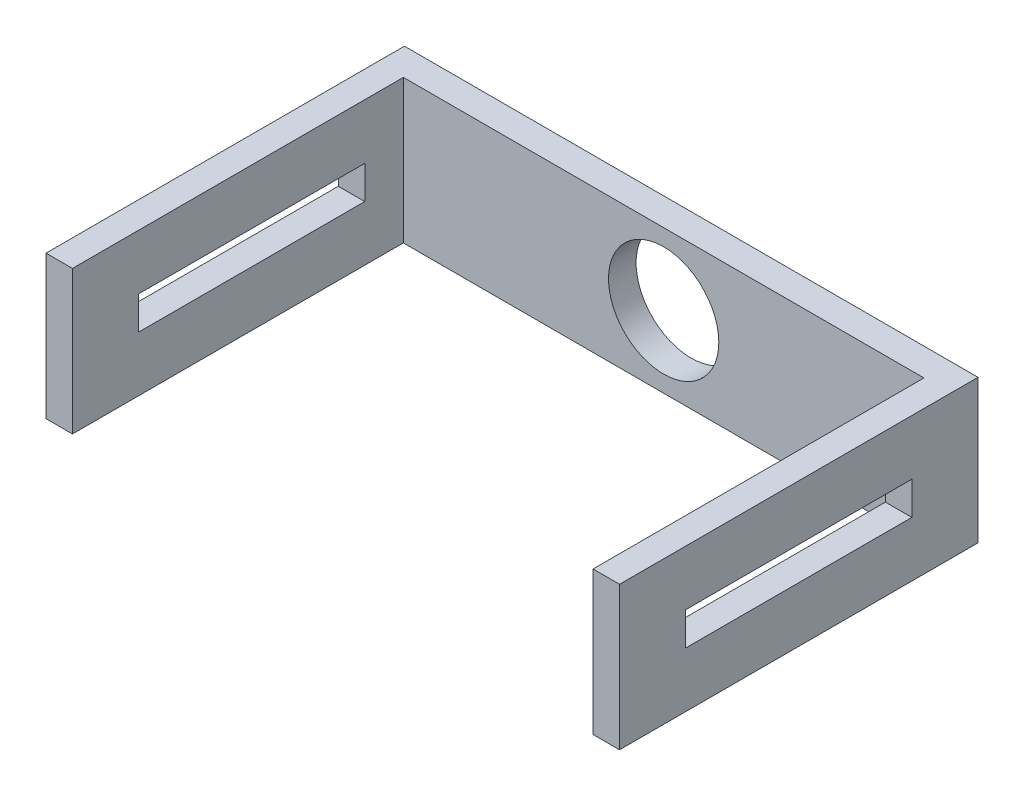
ISO-10303-21;
HEADER;
FILE_DESCRIPTION(('STEP AP214'),'2;1');
FILE_NAME('part.step','',(''),(''),'','','');
FILE_SCHEMA(('AUTOMOTIVE_DESIGN { 1 0 10303 214 1 1 1 1 }'));
ENDSEC;
DATA;
#1=APPLICATION_CONTEXT('core data for automotive mechanical design processes');
#2=APPLICATION_PROTOCOL_DEFINITION('international standard','automotive_design',2000,#1);
#3=PRODUCT_CONTEXT('',#1,'mechanical');
#4=PRODUCT('Part','Part','',(#3));
#5=PRODUCT_RELATED_PRODUCT_CATEGORY('part','',(#4));
#6=PRODUCT_DEFINITION_FORMATION('','',#4);
#7=PRODUCT_DEFINITION_CONTEXT('part definition',#1,'design');
#8=PRODUCT_DEFINITION('design','',#6,#7);
#9=PRODUCT_DEFINITION_SHAPE('','',#8);
#10=(LENGTH_UNIT() NAMED_UNIT(*) SI_UNIT(.MILLI.,.METRE.));
#11=(NAMED_UNIT(*) PLANE_ANGLE_UNIT() SI_UNIT($,.RADIAN.));
#12=(NAMED_UNIT(*) SI_UNIT($,.STERADIAN.) SOLID_ANGLE_UNIT());
#13=UNCERTAINTY_MEASURE_WITH_UNIT(LENGTH_MEASURE(1.E-05),#10,'distance_accuracy_value','');
#14=(GEOMETRIC_REPRESENTATION_CONTEXT(3) GLOBAL_UNCERTAINTY_ASSIGNED_CONTEXT((#13)) GLOBAL_UNIT_ASSIGNED_CONTEXT((#10,
#11,#12)) REPRESENTATION_CONTEXT('',''));
#15=CARTESIAN_POINT('',(0.,0.,0.));
#16=DIRECTION('',(0.,0.,1.));
#17=DIRECTION('',(1.,0.,0.));
#18=AXIS2_PLACEMENT_3D('',#15,#16,#17);
#19=CARTESIAN_POINT('',(0.,0.,2.5));
#20=DIRECTION('',(0.,0.,1.));
#21=DIRECTION('',(1.,0.,0.));
#22=AXIS2_PLACEMENT_3D('',#19,#20,#21);
#23=PLANE('',#22);
#24=CARTESIAN_POINT('',(26.,-6.5,2.5));
#25=DIRECTION('',(0.,0.,1.));
#26=DIRECTION('',(1.,0.,0.));
#27=AXIS2_PLACEMENT_3D('',#24,#25,#26);
#28=CIRCLE('',#27,5.);
#29=CARTESIAN_POINT('',(31.,-6.5,2.5));
#30=VERTEX_POINT('',#29);
#31=EDGE_CURVE('E549',#30,#30,#28,.T.);
#32=ORIENTED_EDGE('',*,*,#31,.F.);
#33=EDGE_LOOP('',(#32));
#34=FACE_BOUND('',#33,.T.);
#35=DIRECTION('',(1.,0.,0.));
#36=VECTOR('',#35,1.);
#37=CARTESIAN_POINT('',(0.,-13.,2.5));
#38=LINE('',#37,#36);
#39=CARTESIAN_POINT('',(2.4,-13.,2.5));
#40=VERTEX_POINT('',#39);
#41=CARTESIAN_POINT('',(49.6,-13.,2.5));
#42=VERTEX_POINT('',#41);
#43=EDGE_CURVE('E277',#40,#42,#38,.T.);
#44=ORIENTED_EDGE('',*,*,#43,.T.);
#45=DIRECTION('',(0.,-1.,0.));
#46=VECTOR('',#45,1.);
#47=CARTESIAN_POINT('',(49.6,0.,2.5));
#48=LINE('',#47,#46);
#49=CARTESIAN_POINT('',(49.6,0.,2.5));
#50=VERTEX_POINT('',#49);
#51=EDGE_CURVE('E224',#50,#42,#48,.T.);
#52=ORIENTED_EDGE('',*,*,#51,.F.);
#53=DIRECTION('',(-1.,0.,0.));
#54=VECTOR('',#53,1.);
#55=CARTESIAN_POINT('',(0.,0.,2.5));
#56=LINE('',#55,#54);
#57=CARTESIAN_POINT('',(2.4,0.,2.5));
#58=VERTEX_POINT('',#57);
#59=EDGE_CURVE('E280',#50,#58,#56,.T.);
#60=ORIENTED_EDGE('',*,*,#59,.T.);
#61=DIRECTION('',(0.,1.,0.));
#62=VECTOR('',#61,1.);
#63=CARTESIAN_POINT('',(2.4,0.,2.5));
#64=LINE('',#63,#62);
#65=EDGE_CURVE('E250',#40,#58,#64,.T.);
#66=ORIENTED_EDGE('',*,*,#65,.F.);
#67=EDGE_LOOP('',(#44,#52,#60,#66));
#68=FACE_BOUND('',#67,.T.);
#69=ADVANCED_FACE('F39',(#34,#68),#23,.T.);
#70=CARTESIAN_POINT('',(0.,0.,2.5));
#71=DIRECTION('',(1.,0.,0.));
#72=DIRECTION('',(0.,1.,0.));
#73=AXIS2_PLACEMENT_3D('',#70,#71,#72);
#74=PLANE('',#73);
#75=DIRECTION('',(0.,0.,1.));
#76=VECTOR('',#75,1.);
#77=CARTESIAN_POINT('',(0.,-8.,6.));
#78=LINE('',#77,#76);
#79=CARTESIAN_POINT('',(0.,-8.,6.));
#80=VERTEX_POINT('',#79);
#81=CARTESIAN_POINT('',(0.,-8.,26.5));
#82=VERTEX_POINT('',#81);
#83=EDGE_CURVE('E170',#80,#82,#78,.T.);
#84=ORIENTED_EDGE('',*,*,#83,.F.);
#85=DIRECTION('',(0.,-1.,0.));
#86=VECTOR('',#85,1.);
#87=CARTESIAN_POINT('',(0.,-5.,6.));
#88=LINE('',#87,#86);
#89=CARTESIAN_POINT('',(0.,-5.,6.));
#90=VERTEX_POINT('',#89);
#91=EDGE_CURVE('E56',#90,#80,#88,.T.);
#92=ORIENTED_EDGE('',*,*,#91,.F.);
#93=DIRECTION('',(0.,0.,-1.));
#94=VECTOR('',#93,1.);
#95=CARTESIAN_POINT('',(0.,-5.,6.));
#96=LINE('',#95,#94);
#97=CARTESIAN_POINT('',(0.,-5.,26.5));
#98=VERTEX_POINT('',#97);
#99=EDGE_CURVE('E178',#98,#90,#96,.T.);
#100=ORIENTED_EDGE('',*,*,#99,.F.);
#101=DIRECTION('',(0.,1.,0.));
#102=VECTOR('',#101,1.);
#103=CARTESIAN_POINT('',(0.,-5.,26.5));
#104=LINE('',#103,#102);
#105=EDGE_CURVE('E160',#82,#98,#104,.T.);
#106=ORIENTED_EDGE('',*,*,#105,.F.);
#107=EDGE_LOOP('',(#84,#92,#100,#106));
#108=FACE_BOUND('',#107,.T.);
#109=DIRECTION('',(0.,-1.,0.));
#110=VECTOR('',#109,1.);
#111=CARTESIAN_POINT('',(0.,0.,0.));
#112=LINE('',#111,#110);
#113=CARTESIAN_POINT('',(0.,0.,0.));
#114=VERTEX_POINT('',#113);
#115=CARTESIAN_POINT('',(0.,-13.,0.));
#116=VERTEX_POINT('',#115);
#117=EDGE_CURVE('E276',#114,#116,#112,.T.);
#118=ORIENTED_EDGE('',*,*,#117,.T.);
#119=DIRECTION('',(0.,0.,-1.));
#120=VECTOR('',#119,1.);
#121=CARTESIAN_POINT('',(0.,-13.,2.5));
#122=LINE('',#121,#120);
#123=CARTESIAN_POINT('',(0.,-13.,32.5));
#124=VERTEX_POINT('',#123);
#125=EDGE_CURVE('E307',#124,#116,#122,.T.);
#126=ORIENTED_EDGE('',*,*,#125,.F.);
#127=DIRECTION('',(0.,-1.,0.));
#128=VECTOR('',#127,1.);
#129=CARTESIAN_POINT('',(0.,0.,32.5));
#130=LINE('',#129,#128);
#131=CARTESIAN_POINT('',(0.,0.,32.5));
#132=VERTEX_POINT('',#131);
#133=EDGE_CURVE('E251',#132,#124,#130,.T.);
#134=ORIENTED_EDGE('',*,*,#133,.F.);
#135=DIRECTION('',(0.,0.,-1.));
#136=VECTOR('',#135,1.);
#137=CARTESIAN_POINT('',(0.,0.,2.5));
#138=LINE('',#137,#136);
#139=EDGE_CURVE('E284',#132,#114,#138,.T.);
#140=ORIENTED_EDGE('',*,*,#139,.T.);
#141=EDGE_LOOP('',(#118,#126,#134,#140));
#142=FACE_BOUND('',#141,.T.);
#143=ADVANCED_FACE('F41',(#108,#142),#74,.F.);
#144=CARTESIAN_POINT('',(0.,-13.,2.5));
#145=DIRECTION('',(0.,1.,0.));
#146=DIRECTION('',(0.,0.,1.));
#147=AXIS2_PLACEMENT_3D('',#144,#145,#146);
#148=PLANE('',#147);
#149=DIRECTION('',(1.,0.,0.));
#150=VECTOR('',#149,1.);
#151=CARTESIAN_POINT('',(0.,-13.,0.));
#152=LINE('',#151,#150);
#153=CARTESIAN_POINT('',(52.,-13.,0.));
#154=VERTEX_POINT('',#153);
#155=EDGE_CURVE('E288',#116,#154,#152,.T.);
#156=ORIENTED_EDGE('',*,*,#155,.T.);
#157=DIRECTION('',(0.,0.,-1.));
#158=VECTOR('',#157,1.);
#159=CARTESIAN_POINT('',(52.,-13.,2.5));
#160=LINE('',#159,#158);
#161=CARTESIAN_POINT('',(52.,-13.,32.5));
#162=VERTEX_POINT('',#161);
#163=EDGE_CURVE('E303',#162,#154,#160,.T.);
#164=ORIENTED_EDGE('',*,*,#163,.F.);
#165=DIRECTION('',(1.,0.,0.));
#166=VECTOR('',#165,1.);
#167=CARTESIAN_POINT('',(52.,-13.,32.5));
#168=LINE('',#167,#166);
#169=CARTESIAN_POINT('',(49.6,-13.,32.5));
#170=VERTEX_POINT('',#169);
#171=EDGE_CURVE('E235',#170,#162,#168,.T.);
#172=ORIENTED_EDGE('',*,*,#171,.F.);
#173=DIRECTION('',(0.,0.,-1.));
#174=VECTOR('',#173,1.);
#175=CARTESIAN_POINT('',(49.6,-13.,32.5));
#176=LINE('',#175,#174);
#177=EDGE_CURVE('E239',#170,#42,#176,.T.);
#178=ORIENTED_EDGE('',*,*,#177,.T.);
#179=ORIENTED_EDGE('',*,*,#43,.F.);
#180=DIRECTION('',(0.,0.,-1.));
#181=VECTOR('',#180,1.);
#182=CARTESIAN_POINT('',(2.4,-13.,32.5));
#183=LINE('',#182,#181);
#184=CARTESIAN_POINT('',(2.4,-13.,32.5));
#185=VERTEX_POINT('',#184);
#186=EDGE_CURVE('E272',#185,#40,#183,.T.);
#187=ORIENTED_EDGE('',*,*,#186,.F.);
#188=DIRECTION('',(1.,0.,0.));
#189=VECTOR('',#188,1.);
#190=CARTESIAN_POINT('',(0.,-13.,32.5));
#191=LINE('',#190,#189);
#192=EDGE_CURVE('E255',#124,#185,#191,.T.);
#193=ORIENTED_EDGE('',*,*,#192,.F.);
#194=ORIENTED_EDGE('',*,*,#125,.T.);
#195=EDGE_LOOP('',(#156,#164,#172,#178,#179,#187,#193,#194));
#196=FACE_BOUND('',#195,.T.);
#197=ADVANCED_FACE('F361',(#196),#148,.F.);
#198=CARTESIAN_POINT('',(52.,0.,2.5));
#199=DIRECTION('',(-1.,0.,0.));
#200=DIRECTION('',(0.,0.,1.));
#201=AXIS2_PLACEMENT_3D('',#198,#199,#200);
#202=PLANE('',#201);
#203=DIRECTION('',(0.,0.,-1.));
#204=VECTOR('',#203,1.);
#205=CARTESIAN_POINT('',(52.,-4.99999999999999,2.5));
#206=LINE('',#205,#204);
#207=CARTESIAN_POINT('',(52.,-4.99999999999999,26.5));
#208=VERTEX_POINT('',#207);
#209=CARTESIAN_POINT('',(52.,-4.99999999999999,6.));
#210=VERTEX_POINT('',#209);
#211=EDGE_CURVE('E212',#208,#210,#206,.T.);
#212=ORIENTED_EDGE('',*,*,#211,.T.);
#213=DIRECTION('',(0.,-1.,0.));
#214=VECTOR('',#213,1.);
#215=CARTESIAN_POINT('',(52.,0.,6.));
#216=LINE('',#215,#214);
#217=CARTESIAN_POINT('',(52.,-7.99999999999999,6.));
#218=VERTEX_POINT('',#217);
#219=EDGE_CURVE('E220',#210,#218,#216,.T.);
#220=ORIENTED_EDGE('',*,*,#219,.T.);
#221=DIRECTION('',(0.,0.,1.));
#222=VECTOR('',#221,1.);
#223=CARTESIAN_POINT('',(52.,-7.99999999999999,2.5));
#224=LINE('',#223,#222);
#225=CARTESIAN_POINT('',(52.,-7.99999999999999,26.5));
#226=VERTEX_POINT('',#225);
#227=EDGE_CURVE('E198',#218,#226,#224,.T.);
#228=ORIENTED_EDGE('',*,*,#227,.T.);
#229=DIRECTION('',(0.,1.,0.));
#230=VECTOR('',#229,1.);
#231=CARTESIAN_POINT('',(52.,0.,26.5));
#232=LINE('',#231,#230);
#233=EDGE_CURVE('E204',#226,#208,#232,.T.);
#234=ORIENTED_EDGE('',*,*,#233,.T.);
#235=EDGE_LOOP('',(#212,#220,#228,#234));
#236=FACE_BOUND('',#235,.T.);
#237=DIRECTION('',(0.,1.,0.));
#238=VECTOR('',#237,1.);
#239=CARTESIAN_POINT('',(52.,0.,0.));
#240=LINE('',#239,#238);
#241=CARTESIAN_POINT('',(52.,0.,0.));
#242=VERTEX_POINT('',#241);
#243=EDGE_CURVE('E291',#154,#242,#240,.T.);
#244=ORIENTED_EDGE('',*,*,#243,.T.);
#245=DIRECTION('',(0.,0.,-1.));
#246=VECTOR('',#245,1.);
#247=CARTESIAN_POINT('',(52.,0.,2.5));
#248=LINE('',#247,#246);
#249=CARTESIAN_POINT('',(52.,0.,32.5));
#250=VERTEX_POINT('',#249);
#251=EDGE_CURVE('E299',#250,#242,#248,.T.);
#252=ORIENTED_EDGE('',*,*,#251,.F.);
#253=DIRECTION('',(0.,1.,0.));
#254=VECTOR('',#253,1.);
#255=CARTESIAN_POINT('',(52.,0.,32.5));
#256=LINE('',#255,#254);
#257=EDGE_CURVE('E225',#162,#250,#256,.T.);
#258=ORIENTED_EDGE('',*,*,#257,.F.);
#259=ORIENTED_EDGE('',*,*,#163,.T.);
#260=EDGE_LOOP('',(#244,#252,#258,#259));
#261=FACE_BOUND('',#260,.T.);
#262=ADVANCED_FACE('F340',(#236,#261),#202,.F.);
#263=CARTESIAN_POINT('',(0.,0.,2.5));
#264=DIRECTION('',(0.,-1.,0.));
#265=DIRECTION('',(0.,0.,-1.));
#266=AXIS2_PLACEMENT_3D('',#263,#264,#265);
#267=PLANE('',#266);
#268=DIRECTION('',(-1.,0.,0.));
#269=VECTOR('',#268,1.);
#270=CARTESIAN_POINT('',(0.,0.,0.));
#271=LINE('',#270,#269);
#272=EDGE_CURVE('E281',#242,#114,#271,.T.);
#273=ORIENTED_EDGE('',*,*,#272,.T.);
#274=ORIENTED_EDGE('',*,*,#139,.F.);
#275=DIRECTION('',(-1.,0.,0.));
#276=VECTOR('',#275,1.);
#277=CARTESIAN_POINT('',(0.,0.,32.5));
#278=LINE('',#277,#276);
#279=CARTESIAN_POINT('',(2.4,0.,32.5));
#280=VERTEX_POINT('',#279);
#281=EDGE_CURVE('E261',#280,#132,#278,.T.);
#282=ORIENTED_EDGE('',*,*,#281,.F.);
#283=DIRECTION('',(0.,0.,-1.));
#284=VECTOR('',#283,1.);
#285=CARTESIAN_POINT('',(2.4,0.,32.5));
#286=LINE('',#285,#284);
#287=EDGE_CURVE('E265',#280,#58,#286,.T.);
#288=ORIENTED_EDGE('',*,*,#287,.T.);
#289=ORIENTED_EDGE('',*,*,#59,.F.);
#290=DIRECTION('',(0.,0.,-1.));
#291=VECTOR('',#290,1.);
#292=CARTESIAN_POINT('',(49.6,0.,32.5));
#293=LINE('',#292,#291);
#294=CARTESIAN_POINT('',(49.6,0.,32.5));
#295=VERTEX_POINT('',#294);
#296=EDGE_CURVE('E246',#295,#50,#293,.T.);
#297=ORIENTED_EDGE('',*,*,#296,.F.);
#298=DIRECTION('',(-1.,0.,0.));
#299=VECTOR('',#298,1.);
#300=CARTESIAN_POINT('',(52.,0.,32.5));
#301=LINE('',#300,#299);
#302=EDGE_CURVE('E229',#250,#295,#301,.T.);
#303=ORIENTED_EDGE('',*,*,#302,.F.);
#304=ORIENTED_EDGE('',*,*,#251,.T.);
#305=EDGE_LOOP('',(#273,#274,#282,#288,#289,#297,#303,#304));
#306=FACE_BOUND('',#305,.T.);
#307=ADVANCED_FACE('F371',(#306),#267,.F.);
#308=CARTESIAN_POINT('',(0.,0.,0.));
#309=DIRECTION('',(0.,0.,1.));
#310=DIRECTION('',(1.,0.,0.));
#311=AXIS2_PLACEMENT_3D('',#308,#309,#310);
#312=PLANE('',#311);
#313=CARTESIAN_POINT('',(26.,-6.5,0.));
#314=DIRECTION('',(0.,0.,1.));
#315=DIRECTION('',(1.,0.,0.));
#316=AXIS2_PLACEMENT_3D('',#313,#314,#315);
#317=CIRCLE('',#316,5.);
#318=CARTESIAN_POINT('',(31.,-6.5,0.));
#319=VERTEX_POINT('',#318);
#320=EDGE_CURVE('E43',#319,#319,#317,.T.);
#321=ORIENTED_EDGE('',*,*,#320,.T.);
#322=EDGE_LOOP('',(#321));
#323=FACE_BOUND('',#322,.T.);
#324=ORIENTED_EDGE('',*,*,#117,.F.);
#325=ORIENTED_EDGE('',*,*,#272,.F.);
#326=ORIENTED_EDGE('',*,*,#243,.F.);
#327=ORIENTED_EDGE('',*,*,#155,.F.);
#328=EDGE_LOOP('',(#324,#325,#326,#327));
#329=FACE_BOUND('',#328,.T.);
#330=ADVANCED_FACE('F368',(#323,#329),#312,.F.);
#331=CARTESIAN_POINT('',(2.4,0.,32.5));
#332=DIRECTION('',(-1.,0.,0.));
#333=DIRECTION('',(0.,-1.,0.));
#334=AXIS2_PLACEMENT_3D('',#331,#332,#333);
#335=PLANE('',#334);
#336=DIRECTION('',(0.,0.,-1.));
#337=VECTOR('',#336,1.);
#338=CARTESIAN_POINT('',(2.4,-5.,32.5));
#339=LINE('',#338,#337);
#340=CARTESIAN_POINT('',(2.4,-5.,26.5));
#341=VERTEX_POINT('',#340);
#342=CARTESIAN_POINT('',(2.4,-5.,6.));
#343=VERTEX_POINT('',#342);
#344=EDGE_CURVE('E208',#341,#343,#339,.T.);
#345=ORIENTED_EDGE('',*,*,#344,.T.);
#346=DIRECTION('',(0.,-1.,0.));
#347=VECTOR('',#346,1.);
#348=CARTESIAN_POINT('',(2.4,0.,6.));
#349=LINE('',#348,#347);
#350=CARTESIAN_POINT('',(2.4,-8.,6.));
#351=VERTEX_POINT('',#350);
#352=EDGE_CURVE('E216',#343,#351,#349,.T.);
#353=ORIENTED_EDGE('',*,*,#352,.T.);
#354=DIRECTION('',(0.,0.,1.));
#355=VECTOR('',#354,1.);
#356=CARTESIAN_POINT('',(2.4,-8.,32.5));
#357=LINE('',#356,#355);
#358=CARTESIAN_POINT('',(2.4,-8.,26.5));
#359=VERTEX_POINT('',#358);
#360=EDGE_CURVE('E195',#351,#359,#357,.T.);
#361=ORIENTED_EDGE('',*,*,#360,.T.);
#362=DIRECTION('',(0.,1.,0.));
#363=VECTOR('',#362,1.);
#364=CARTESIAN_POINT('',(2.4,0.,26.5));
#365=LINE('',#364,#363);
#366=EDGE_CURVE('E163',#359,#341,#365,.T.);
#367=ORIENTED_EDGE('',*,*,#366,.T.);
#368=EDGE_LOOP('',(#345,#353,#361,#367));
#369=FACE_BOUND('',#368,.T.);
#370=ORIENTED_EDGE('',*,*,#65,.T.);
#371=ORIENTED_EDGE('',*,*,#287,.F.);
#372=DIRECTION('',(0.,1.,0.));
#373=VECTOR('',#372,1.);
#374=CARTESIAN_POINT('',(2.4,0.,32.5));
#375=LINE('',#374,#373);
#376=EDGE_CURVE('E258',#185,#280,#375,.T.);
#377=ORIENTED_EDGE('',*,*,#376,.F.);
#378=ORIENTED_EDGE('',*,*,#186,.T.);
#379=EDGE_LOOP('',(#370,#371,#377,#378));
#380=FACE_BOUND('',#379,.T.);
#381=ADVANCED_FACE('F366',(#369,#380),#335,.F.);
#382=CARTESIAN_POINT('',(0.,0.,32.5));
#383=DIRECTION('',(0.,0.,1.));
#384=DIRECTION('',(1.,0.,0.));
#385=AXIS2_PLACEMENT_3D('',#382,#383,#384);
#386=PLANE('',#385);
#387=ORIENTED_EDGE('',*,*,#133,.T.);
#388=ORIENTED_EDGE('',*,*,#192,.T.);
#389=ORIENTED_EDGE('',*,*,#376,.T.);
#390=ORIENTED_EDGE('',*,*,#281,.T.);
#391=EDGE_LOOP('',(#387,#388,#389,#390));
#392=FACE_BOUND('',#391,.T.);
#393=ADVANCED_FACE('F392',(#392),#386,.T.);
#394=CARTESIAN_POINT('',(49.6,0.,32.5));
#395=DIRECTION('',(1.,0.,0.));
#396=DIRECTION('',(0.,0.,-1.));
#397=AXIS2_PLACEMENT_3D('',#394,#395,#396);
#398=PLANE('',#397);
#399=DIRECTION('',(0.,0.,-1.));
#400=VECTOR('',#399,1.);
#401=CARTESIAN_POINT('',(49.6,-7.99999999999999,32.5));
#402=LINE('',#401,#400);
#403=CARTESIAN_POINT('',(49.6,-7.99999999999999,26.5));
#404=VERTEX_POINT('',#403);
#405=CARTESIAN_POINT('',(49.6,-7.99999999999999,6.));
#406=VERTEX_POINT('',#405);
#407=EDGE_CURVE('E311',#404,#406,#402,.T.);
#408=ORIENTED_EDGE('',*,*,#407,.T.);
#409=DIRECTION('',(0.,1.,0.));
#410=VECTOR('',#409,1.);
#411=CARTESIAN_POINT('',(49.6,0.,6.));
#412=LINE('',#411,#410);
#413=CARTESIAN_POINT('',(49.6,-4.99999999999999,6.));
#414=VERTEX_POINT('',#413);
#415=EDGE_CURVE('E11',#406,#414,#412,.T.);
#416=ORIENTED_EDGE('',*,*,#415,.T.);
#417=DIRECTION('',(0.,0.,1.));
#418=VECTOR('',#417,1.);
#419=CARTESIAN_POINT('',(49.6,-4.99999999999999,32.5));
#420=LINE('',#419,#418);
#421=CARTESIAN_POINT('',(49.6,-4.99999999999999,26.5));
#422=VERTEX_POINT('',#421);
#423=EDGE_CURVE('E49',#414,#422,#420,.T.);
#424=ORIENTED_EDGE('',*,*,#423,.T.);
#425=DIRECTION('',(0.,-1.,0.));
#426=VECTOR('',#425,1.);
#427=CARTESIAN_POINT('',(49.6,0.,26.5));
#428=LINE('',#427,#426);
#429=EDGE_CURVE('E315',#422,#404,#428,.T.);
#430=ORIENTED_EDGE('',*,*,#429,.T.);
#431=EDGE_LOOP('',(#408,#416,#424,#430));
#432=FACE_BOUND('',#431,.T.);
#433=ORIENTED_EDGE('',*,*,#51,.T.);
#434=ORIENTED_EDGE('',*,*,#177,.F.);
#435=DIRECTION('',(0.,-1.,0.));
#436=VECTOR('',#435,1.);
#437=CARTESIAN_POINT('',(49.6,0.,32.5));
#438=LINE('',#437,#436);
#439=EDGE_CURVE('E232',#295,#170,#438,.T.);
#440=ORIENTED_EDGE('',*,*,#439,.F.);
#441=ORIENTED_EDGE('',*,*,#296,.T.);
#442=EDGE_LOOP('',(#433,#434,#440,#441));
#443=FACE_BOUND('',#442,.T.);
#444=ADVANCED_FACE('F322',(#432,#443),#398,.F.);
#445=CARTESIAN_POINT('',(0.,0.,32.5));
#446=DIRECTION('',(0.,0.,-1.));
#447=DIRECTION('',(-1.,0.,0.));
#448=AXIS2_PLACEMENT_3D('',#445,#446,#447);
#449=PLANE('',#448);
#450=ORIENTED_EDGE('',*,*,#257,.T.);
#451=ORIENTED_EDGE('',*,*,#302,.T.);
#452=ORIENTED_EDGE('',*,*,#439,.T.);
#453=ORIENTED_EDGE('',*,*,#171,.T.);
#454=EDGE_LOOP('',(#450,#451,#452,#453));
#455=FACE_BOUND('',#454,.T.);
#456=ADVANCED_FACE('F352',(#455),#449,.F.);
#457=CARTESIAN_POINT('',(55.,-7.99999999999999,6.));
#458=DIRECTION('',(0.,-1.,0.));
#459=DIRECTION('',(1.,0.,0.));
#460=AXIS2_PLACEMENT_3D('',#457,#458,#459);
#461=PLANE('',#460);
#462=DIRECTION('',(-1.,0.,0.));
#463=VECTOR('',#462,1.);
#464=CARTESIAN_POINT('',(55.,-7.99999999999999,6.));
#465=LINE('',#464,#463);
#466=EDGE_CURVE('E167',#218,#406,#465,.T.);
#467=ORIENTED_EDGE('',*,*,#466,.T.);
#468=ORIENTED_EDGE('',*,*,#407,.F.);
#469=DIRECTION('',(-1.,0.,0.));
#470=VECTOR('',#469,1.);
#471=CARTESIAN_POINT('',(55.,-7.99999999999999,26.5));
#472=LINE('',#471,#470);
#473=EDGE_CURVE('E64',#226,#404,#472,.T.);
#474=ORIENTED_EDGE('',*,*,#473,.F.);
#475=ORIENTED_EDGE('',*,*,#227,.F.);
#476=EDGE_LOOP('',(#467,#468,#474,#475));
#477=FACE_BOUND('',#476,.T.);
#478=ADVANCED_FACE('F338',(#477),#461,.F.);
#479=CARTESIAN_POINT('',(55.,-4.99999999999999,26.5));
#480=DIRECTION('',(0.,0.,1.));
#481=DIRECTION('',(1.,0.,0.));
#482=AXIS2_PLACEMENT_3D('',#479,#480,#481);
#483=PLANE('',#482);
#484=ORIENTED_EDGE('',*,*,#473,.T.);
#485=ORIENTED_EDGE('',*,*,#429,.F.);
#486=DIRECTION('',(-1.,0.,0.));
#487=VECTOR('',#486,1.);
#488=CARTESIAN_POINT('',(55.,-4.99999999999999,26.5));
#489=LINE('',#488,#487);
#490=EDGE_CURVE('E189',#208,#422,#489,.T.);
#491=ORIENTED_EDGE('',*,*,#490,.F.);
#492=ORIENTED_EDGE('',*,*,#233,.F.);
#493=EDGE_LOOP('',(#484,#485,#491,#492));
#494=FACE_BOUND('',#493,.T.);
#495=ADVANCED_FACE('F343',(#494),#483,.F.);
#496=CARTESIAN_POINT('',(55.,-4.99999999999999,6.));
#497=DIRECTION('',(0.,1.,0.));
#498=DIRECTION('',(-1.,0.,0.));
#499=AXIS2_PLACEMENT_3D('',#496,#497,#498);
#500=PLANE('',#499);
#501=ORIENTED_EDGE('',*,*,#490,.T.);
#502=ORIENTED_EDGE('',*,*,#423,.F.);
#503=DIRECTION('',(-1.,0.,0.));
#504=VECTOR('',#503,1.);
#505=CARTESIAN_POINT('',(55.,-4.99999999999999,6.));
#506=LINE('',#505,#504);
#507=EDGE_CURVE('E188',#210,#414,#506,.T.);
#508=ORIENTED_EDGE('',*,*,#507,.F.);
#509=ORIENTED_EDGE('',*,*,#211,.F.);
#510=EDGE_LOOP('',(#501,#502,#508,#509));
#511=FACE_BOUND('',#510,.T.);
#512=ADVANCED_FACE('F329',(#511),#500,.F.);
#513=CARTESIAN_POINT('',(55.,-4.99999999999999,6.));
#514=DIRECTION('',(0.,0.,-1.));
#515=DIRECTION('',(-1.,0.,0.));
#516=AXIS2_PLACEMENT_3D('',#513,#514,#515);
#517=PLANE('',#516);
#518=ORIENTED_EDGE('',*,*,#507,.T.);
#519=ORIENTED_EDGE('',*,*,#415,.F.);
#520=ORIENTED_EDGE('',*,*,#466,.F.);
#521=ORIENTED_EDGE('',*,*,#219,.F.);
#522=EDGE_LOOP('',(#518,#519,#520,#521));
#523=FACE_BOUND('',#522,.T.);
#524=ADVANCED_FACE('F332',(#523),#517,.F.);
#525=EDGE_CURVE('E185',#343,#90,#506,.T.);
#526=ORIENTED_EDGE('',*,*,#525,.T.);
#527=ORIENTED_EDGE('',*,*,#91,.T.);
#528=EDGE_CURVE('E172',#351,#80,#465,.T.);
#529=ORIENTED_EDGE('',*,*,#528,.F.);
#530=ORIENTED_EDGE('',*,*,#352,.F.);
#531=EDGE_LOOP('',(#526,#527,#529,#530));
#532=FACE_BOUND('',#531,.T.);
#533=ADVANCED_FACE('F419',(#532),#517,.F.);
#534=EDGE_CURVE('E190',#341,#98,#489,.T.);
#535=ORIENTED_EDGE('',*,*,#534,.T.);
#536=ORIENTED_EDGE('',*,*,#99,.T.);
#537=ORIENTED_EDGE('',*,*,#525,.F.);
#538=ORIENTED_EDGE('',*,*,#344,.F.);
#539=EDGE_LOOP('',(#535,#536,#537,#538));
#540=FACE_BOUND('',#539,.T.);
#541=ADVANCED_FACE('F351',(#540),#500,.F.);
#542=EDGE_CURVE('E155',#359,#82,#472,.T.);
#543=ORIENTED_EDGE('',*,*,#542,.T.);
#544=ORIENTED_EDGE('',*,*,#105,.T.);
#545=ORIENTED_EDGE('',*,*,#534,.F.);
#546=ORIENTED_EDGE('',*,*,#366,.F.);
#547=EDGE_LOOP('',(#543,#544,#545,#546));
#548=FACE_BOUND('',#547,.T.);
#549=ADVANCED_FACE('F157',(#548),#483,.F.);
#550=ORIENTED_EDGE('',*,*,#528,.T.);
#551=ORIENTED_EDGE('',*,*,#83,.T.);
#552=ORIENTED_EDGE('',*,*,#542,.F.);
#553=ORIENTED_EDGE('',*,*,#360,.F.);
#554=EDGE_LOOP('',(#550,#551,#552,#553));
#555=FACE_BOUND('',#554,.T.);
#556=ADVANCED_FACE('F171',(#555),#461,.F.);
#557=CARTESIAN_POINT('',(26.,-6.5,-52.5));
#558=DIRECTION('',(0.,0.,1.));
#559=DIRECTION('',(1.,0.,0.));
#560=AXIS2_PLACEMENT_3D('',#557,#558,#559);
#561=CYLINDRICAL_SURFACE('',#560,5.);
#562=ORIENTED_EDGE('',*,*,#31,.T.);
#563=EDGE_LOOP('',(#562));
#564=FACE_BOUND('',#563,.T.);
#565=ORIENTED_EDGE('',*,*,#320,.F.);
#566=EDGE_LOOP('',(#565));
#567=FACE_BOUND('',#566,.T.);
#568=ADVANCED_FACE('F518',(#564,#567),#561,.F.);
#569=CLOSED_SHELL('',(#69,#143,#197,#262,#307,#330,#381,#393,#444,#456,#478,#495,#512,#524,#533,
#541,#549,#556,#568));
#570=MANIFOLD_SOLID_BREP('B2',#569);
#571=ADVANCED_BREP_SHAPE_REPRESENTATION('',(#18,#570),#14);
#572=SHAPE_DEFINITION_REPRESENTATION(#9,#571);
ENDSEC;
END-ISO-10303-21;
